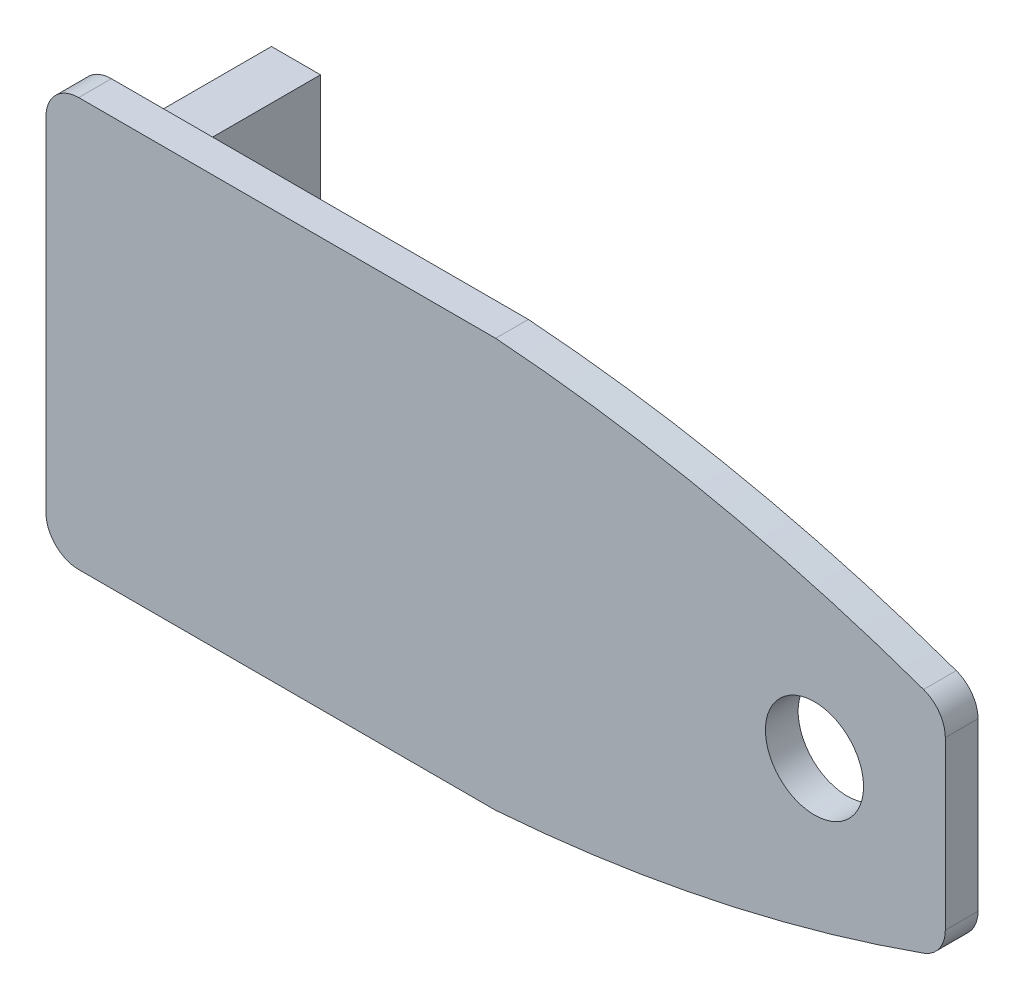
ISO-10303-21;
HEADER;
FILE_DESCRIPTION(('STEP AP214'),'2;1');
FILE_NAME('part.step','',(''),(''),'','','');
FILE_SCHEMA(('AUTOMOTIVE_DESIGN { 1 0 10303 214 1 1 1 1 }'));
ENDSEC;
DATA;
#1=APPLICATION_CONTEXT('core data for automotive mechanical design processes');
#2=APPLICATION_PROTOCOL_DEFINITION('international standard','automotive_design',2000,#1);
#3=PRODUCT_CONTEXT('',#1,'mechanical');
#4=PRODUCT('Part','Part','',(#3));
#5=PRODUCT_RELATED_PRODUCT_CATEGORY('part','',(#4));
#6=PRODUCT_DEFINITION_FORMATION('','',#4);
#7=PRODUCT_DEFINITION_CONTEXT('part definition',#1,'design');
#8=PRODUCT_DEFINITION('design','',#6,#7);
#9=PRODUCT_DEFINITION_SHAPE('','',#8);
#10=(LENGTH_UNIT() NAMED_UNIT(*) SI_UNIT(.MILLI.,.METRE.));
#11=(NAMED_UNIT(*) PLANE_ANGLE_UNIT() SI_UNIT($,.RADIAN.));
#12=(NAMED_UNIT(*) SI_UNIT($,.STERADIAN.) SOLID_ANGLE_UNIT());
#13=UNCERTAINTY_MEASURE_WITH_UNIT(LENGTH_MEASURE(1.E-05),#10,'distance_accuracy_value','');
#14=(GEOMETRIC_REPRESENTATION_CONTEXT(3) GLOBAL_UNCERTAINTY_ASSIGNED_CONTEXT((#13)) GLOBAL_UNIT_ASSIGNED_CONTEXT((#10,
#11,#12)) REPRESENTATION_CONTEXT('',''));
#15=CARTESIAN_POINT('',(0.,0.,0.));
#16=DIRECTION('',(0.,0.,1.));
#17=DIRECTION('',(1.,0.,0.));
#18=AXIS2_PLACEMENT_3D('',#15,#16,#17);
#19=CARTESIAN_POINT('',(34.925,-15.875,2.54));
#20=DIRECTION('',(-1.,0.,0.));
#21=DIRECTION('',(0.,0.,1.));
#22=AXIS2_PLACEMENT_3D('',#19,#20,#21);
#23=PLANE('',#22);
#24=DIRECTION('',(0.,1.,0.));
#25=VECTOR('',#24,1.);
#26=CARTESIAN_POINT('',(34.925,-15.875,0.));
#27=LINE('',#26,#25);
#28=CARTESIAN_POINT('',(34.925,-6.47631169509133,0.));
#29=VERTEX_POINT('',#28);
#30=CARTESIAN_POINT('',(34.925,6.47631169509136,0.));
#31=VERTEX_POINT('',#30);
#32=EDGE_CURVE('E210',#29,#31,#27,.T.);
#33=ORIENTED_EDGE('',*,*,#32,.T.);
#34=DIRECTION('',(0.,0.,1.));
#35=VECTOR('',#34,1.);
#36=CARTESIAN_POINT('',(34.925,6.47631169509136,2.54));
#37=LINE('',#36,#35);
#38=CARTESIAN_POINT('',(34.925,6.47631169509136,2.54));
#39=VERTEX_POINT('',#38);
#40=EDGE_CURVE('E244',#31,#39,#37,.T.);
#41=ORIENTED_EDGE('',*,*,#40,.T.);
#42=DIRECTION('',(0.,1.,0.));
#43=VECTOR('',#42,1.);
#44=CARTESIAN_POINT('',(34.925,-15.875,2.54));
#45=LINE('',#44,#43);
#46=CARTESIAN_POINT('',(34.925,-6.47631169509133,2.54));
#47=VERTEX_POINT('',#46);
#48=EDGE_CURVE('E189',#47,#39,#45,.T.);
#49=ORIENTED_EDGE('',*,*,#48,.F.);
#50=DIRECTION('',(0.,0.,1.));
#51=VECTOR('',#50,1.);
#52=CARTESIAN_POINT('',(34.925,-6.47631169509133,2.54));
#53=LINE('',#52,#51);
#54=EDGE_CURVE('E245',#47,#29,#53,.F.);
#55=ORIENTED_EDGE('',*,*,#54,.T.);
#56=EDGE_LOOP('',(#33,#41,#49,#55));
#57=FACE_BOUND('',#56,.T.);
#58=ADVANCED_FACE('F50',(#57),#23,.F.);
#59=CARTESIAN_POINT('',(34.925,15.875,2.54));
#60=DIRECTION('',(0.,-1.,0.));
#61=DIRECTION('',(0.,0.,-1.));
#62=AXIS2_PLACEMENT_3D('',#59,#60,#61);
#63=PLANE('',#62);
#64=DIRECTION('',(-1.,0.,0.));
#65=VECTOR('',#64,1.);
#66=CARTESIAN_POINT('',(34.925,15.875,0.));
#67=LINE('',#66,#65);
#68=CARTESIAN_POINT('',(0.,15.875,0.));
#69=VERTEX_POINT('',#68);
#70=CARTESIAN_POINT('',(-32.385,15.875,0.));
#71=VERTEX_POINT('',#70);
#72=EDGE_CURVE('E214',#69,#71,#67,.T.);
#73=ORIENTED_EDGE('',*,*,#72,.T.);
#74=DIRECTION('',(0.,0.,-1.));
#75=VECTOR('',#74,1.);
#76=CARTESIAN_POINT('',(-32.385,15.875,2.54));
#77=LINE('',#76,#75);
#78=CARTESIAN_POINT('',(-32.385,15.875,2.54));
#79=VERTEX_POINT('',#78);
#80=EDGE_CURVE('E184',#71,#79,#77,.F.);
#81=ORIENTED_EDGE('',*,*,#80,.T.);
#82=DIRECTION('',(-1.,0.,0.));
#83=VECTOR('',#82,1.);
#84=CARTESIAN_POINT('',(34.925,15.875,2.54));
#85=LINE('',#84,#83);
#86=CARTESIAN_POINT('',(0.,15.875,2.54));
#87=VERTEX_POINT('',#86);
#88=EDGE_CURVE('E180',#87,#79,#85,.T.);
#89=ORIENTED_EDGE('',*,*,#88,.F.);
#90=DIRECTION('',(0.,0.,1.));
#91=VECTOR('',#90,1.);
#92=CARTESIAN_POINT('',(0.,15.875,-7.62));
#93=LINE('',#92,#91);
#94=EDGE_CURVE('E163',#69,#87,#93,.T.);
#95=ORIENTED_EDGE('',*,*,#94,.F.);
#96=EDGE_LOOP('',(#73,#81,#89,#95));
#97=FACE_BOUND('',#96,.T.);
#98=ADVANCED_FACE('F182',(#97),#63,.F.);
#99=CARTESIAN_POINT('',(0.,0.,0.));
#100=DIRECTION('',(0.,0.,1.));
#101=DIRECTION('',(1.,0.,0.));
#102=AXIS2_PLACEMENT_3D('',#99,#100,#101);
#103=PLANE('',#102);
#104=CARTESIAN_POINT('',(24.765,0.,0.));
#105=DIRECTION('',(0.,0.,1.));
#106=DIRECTION('',(1.,0.,0.));
#107=AXIS2_PLACEMENT_3D('',#104,#105,#106);
#108=CIRCLE('',#107,3.81);
#109=CARTESIAN_POINT('',(28.575,0.,0.));
#110=VERTEX_POINT('',#109);
#111=EDGE_CURVE('E379',#110,#110,#108,.T.);
#112=ORIENTED_EDGE('',*,*,#111,.T.);
#113=EDGE_LOOP('',(#112));
#114=FACE_BOUND('',#113,.T.);
#115=DIRECTION('',(0.,-1.,0.));
#116=VECTOR('',#115,1.);
#117=CARTESIAN_POINT('',(-25.7952924012449,-14.605,0.));
#118=LINE('',#117,#116);
#119=CARTESIAN_POINT('',(-25.7952924012449,14.605,0.));
#120=VERTEX_POINT('',#119);
#121=CARTESIAN_POINT('',(-25.7952924012449,-14.605,0.));
#122=VERTEX_POINT('',#121);
#123=EDGE_CURVE('E347',#120,#122,#118,.T.);
#124=ORIENTED_EDGE('',*,*,#123,.F.);
#125=DIRECTION('',(1.,0.,0.));
#126=VECTOR('',#125,1.);
#127=CARTESIAN_POINT('',(-29.6052924012449,14.605,0.));
#128=LINE('',#127,#126);
#129=CARTESIAN_POINT('',(-29.6052924012449,14.605,0.));
#130=VERTEX_POINT('',#129);
#131=EDGE_CURVE('E334',#130,#120,#128,.T.);
#132=ORIENTED_EDGE('',*,*,#131,.F.);
#133=DIRECTION('',(0.,1.,0.));
#134=VECTOR('',#133,1.);
#135=CARTESIAN_POINT('',(-29.6052924012449,-14.605,0.));
#136=LINE('',#135,#134);
#137=CARTESIAN_POINT('',(-29.6052924012449,-14.605,0.));
#138=VERTEX_POINT('',#137);
#139=EDGE_CURVE('E338',#138,#130,#136,.T.);
#140=ORIENTED_EDGE('',*,*,#139,.F.);
#141=DIRECTION('',(-1.,0.,0.));
#142=VECTOR('',#141,1.);
#143=CARTESIAN_POINT('',(-29.6052924012449,-14.605,0.));
#144=LINE('',#143,#142);
#145=EDGE_CURVE('E343',#122,#138,#144,.T.);
#146=ORIENTED_EDGE('',*,*,#145,.F.);
#147=EDGE_LOOP('',(#124,#132,#140,#146));
#148=FACE_BOUND('',#147,.T.);
#149=CARTESIAN_POINT('',(-9.34027816487747,-110.781066589022,0.));
#150=DIRECTION('',(0.,0.,1.));
#151=DIRECTION('',(1.,0.,0.));
#152=AXIS2_PLACEMENT_3D('',#149,#150,#151);
#153=CIRCLE('',#152,127.);
#154=CARTESIAN_POINT('',(33.2365362890791,8.86931941517528,0.));
#155=VERTEX_POINT('',#154);
#156=EDGE_CURVE('E164',#69,#155,#153,.F.);
#157=ORIENTED_EDGE('',*,*,#156,.T.);
#158=CARTESIAN_POINT('',(32.385,6.47631169509136,0.));
#159=DIRECTION('',(0.,0.,1.));
#160=DIRECTION('',(1.,0.,0.));
#161=AXIS2_PLACEMENT_3D('',#158,#159,#160);
#162=CIRCLE('',#161,2.54);
#163=EDGE_CURVE('E57',#155,#31,#162,.F.);
#164=ORIENTED_EDGE('',*,*,#163,.T.);
#165=ORIENTED_EDGE('',*,*,#32,.F.);
#166=CARTESIAN_POINT('',(32.385,-6.47631169509133,0.));
#167=DIRECTION('',(0.,0.,1.));
#168=DIRECTION('',(1.,0.,0.));
#169=AXIS2_PLACEMENT_3D('',#166,#167,#168);
#170=CIRCLE('',#169,2.54);
#171=CARTESIAN_POINT('',(33.2365362890791,-8.86931941517526,0.));
#172=VERTEX_POINT('',#171);
#173=EDGE_CURVE('E65',#29,#172,#170,.F.);
#174=ORIENTED_EDGE('',*,*,#173,.T.);
#175=CARTESIAN_POINT('',(-9.3402781648775,110.781066589022,0.));
#176=DIRECTION('',(0.,0.,1.));
#177=DIRECTION('',(1.,0.,0.));
#178=AXIS2_PLACEMENT_3D('',#175,#176,#177);
#179=CIRCLE('',#178,127.);
#180=CARTESIAN_POINT('',(0.,-15.875,0.));
#181=VERTEX_POINT('',#180);
#182=EDGE_CURVE('E171',#172,#181,#179,.F.);
#183=ORIENTED_EDGE('',*,*,#182,.T.);
#184=DIRECTION('',(1.,0.,0.));
#185=VECTOR('',#184,1.);
#186=CARTESIAN_POINT('',(34.925,-15.875,0.));
#187=LINE('',#186,#185);
#188=CARTESIAN_POINT('',(-32.385,-15.875,0.));
#189=VERTEX_POINT('',#188);
#190=EDGE_CURVE('E205',#189,#181,#187,.T.);
#191=ORIENTED_EDGE('',*,*,#190,.F.);
#192=CARTESIAN_POINT('',(-32.385,-13.335,0.));
#193=DIRECTION('',(0.,0.,1.));
#194=DIRECTION('',(1.,0.,0.));
#195=AXIS2_PLACEMENT_3D('',#192,#193,#194);
#196=CIRCLE('',#195,2.54);
#197=CARTESIAN_POINT('',(-34.925,-13.335,0.));
#198=VERTEX_POINT('',#197);
#199=EDGE_CURVE('E222',#189,#198,#196,.F.);
#200=ORIENTED_EDGE('',*,*,#199,.T.);
#201=DIRECTION('',(0.,-1.,0.));
#202=VECTOR('',#201,1.);
#203=CARTESIAN_POINT('',(-34.925,-15.875,0.));
#204=LINE('',#203,#202);
#205=CARTESIAN_POINT('',(-34.925,13.335,0.));
#206=VERTEX_POINT('',#205);
#207=EDGE_CURVE('E197',#206,#198,#204,.T.);
#208=ORIENTED_EDGE('',*,*,#207,.F.);
#209=CARTESIAN_POINT('',(-32.385,13.335,0.));
#210=DIRECTION('',(0.,0.,1.));
#211=DIRECTION('',(1.,0.,0.));
#212=AXIS2_PLACEMENT_3D('',#209,#210,#211);
#213=CIRCLE('',#212,2.54);
#214=EDGE_CURVE('E223',#206,#71,#213,.F.);
#215=ORIENTED_EDGE('',*,*,#214,.T.);
#216=ORIENTED_EDGE('',*,*,#72,.F.);
#217=EDGE_LOOP('',(#157,#164,#165,#174,#183,#191,#200,#208,#215,#216));
#218=FACE_BOUND('',#217,.T.);
#219=ADVANCED_FACE('F258',(#114,#148,#218),#103,.F.);
#220=CARTESIAN_POINT('',(0.,0.,2.54));
#221=DIRECTION('',(0.,0.,1.));
#222=DIRECTION('',(1.,0.,0.));
#223=AXIS2_PLACEMENT_3D('',#220,#221,#222);
#224=PLANE('',#223);
#225=CARTESIAN_POINT('',(24.765,0.,2.54));
#226=DIRECTION('',(0.,0.,1.));
#227=DIRECTION('',(1.,0.,0.));
#228=AXIS2_PLACEMENT_3D('',#225,#226,#227);
#229=CIRCLE('',#228,3.81);
#230=CARTESIAN_POINT('',(28.575,0.,2.54));
#231=VERTEX_POINT('',#230);
#232=EDGE_CURVE('E383',#231,#231,#229,.T.);
#233=ORIENTED_EDGE('',*,*,#232,.F.);
#234=EDGE_LOOP('',(#233));
#235=FACE_BOUND('',#234,.T.);
#236=ORIENTED_EDGE('',*,*,#48,.T.);
#237=CARTESIAN_POINT('',(32.385,6.47631169509136,2.54));
#238=DIRECTION('',(0.,0.,1.));
#239=DIRECTION('',(1.,0.,0.));
#240=AXIS2_PLACEMENT_3D('',#237,#238,#239);
#241=CIRCLE('',#240,2.54);
#242=CARTESIAN_POINT('',(33.2365362890791,8.86931941517528,2.54));
#243=VERTEX_POINT('',#242);
#244=EDGE_CURVE('E177',#39,#243,#241,.T.);
#245=ORIENTED_EDGE('',*,*,#244,.T.);
#246=CARTESIAN_POINT('',(-9.34027816487747,-110.781066589022,2.54));
#247=DIRECTION('',(0.,0.,-1.));
#248=DIRECTION('',(-1.,0.,0.));
#249=AXIS2_PLACEMENT_3D('',#246,#247,#248);
#250=CIRCLE('',#249,127.);
#251=EDGE_CURVE('E165',#87,#243,#250,.T.);
#252=ORIENTED_EDGE('',*,*,#251,.F.);
#253=ORIENTED_EDGE('',*,*,#88,.T.);
#254=CARTESIAN_POINT('',(-32.385,13.335,2.54));
#255=DIRECTION('',(0.,0.,1.));
#256=DIRECTION('',(1.,0.,0.));
#257=AXIS2_PLACEMENT_3D('',#254,#255,#256);
#258=CIRCLE('',#257,2.54);
#259=CARTESIAN_POINT('',(-34.925,13.335,2.54));
#260=VERTEX_POINT('',#259);
#261=EDGE_CURVE('E234',#79,#260,#258,.T.);
#262=ORIENTED_EDGE('',*,*,#261,.T.);
#263=DIRECTION('',(0.,-1.,0.));
#264=VECTOR('',#263,1.);
#265=CARTESIAN_POINT('',(-34.925,-15.875,2.54));
#266=LINE('',#265,#264);
#267=CARTESIAN_POINT('',(-34.925,-13.335,2.54));
#268=VERTEX_POINT('',#267);
#269=EDGE_CURVE('E215',#260,#268,#266,.T.);
#270=ORIENTED_EDGE('',*,*,#269,.T.);
#271=CARTESIAN_POINT('',(-32.385,-13.335,2.54));
#272=DIRECTION('',(0.,0.,1.));
#273=DIRECTION('',(1.,0.,0.));
#274=AXIS2_PLACEMENT_3D('',#271,#272,#273);
#275=CIRCLE('',#274,2.54);
#276=CARTESIAN_POINT('',(-32.385,-15.875,2.54));
#277=VERTEX_POINT('',#276);
#278=EDGE_CURVE('E240',#268,#277,#275,.T.);
#279=ORIENTED_EDGE('',*,*,#278,.T.);
#280=DIRECTION('',(1.,0.,0.));
#281=VECTOR('',#280,1.);
#282=CARTESIAN_POINT('',(34.925,-15.875,2.54));
#283=LINE('',#282,#281);
#284=CARTESIAN_POINT('',(0.,-15.875,2.54));
#285=VERTEX_POINT('',#284);
#286=EDGE_CURVE('E193',#277,#285,#283,.T.);
#287=ORIENTED_EDGE('',*,*,#286,.T.);
#288=CARTESIAN_POINT('',(-9.3402781648775,110.781066589022,2.54));
#289=DIRECTION('',(0.,0.,-1.));
#290=DIRECTION('',(1.,0.,0.));
#291=AXIS2_PLACEMENT_3D('',#288,#289,#290);
#292=CIRCLE('',#291,127.);
#293=CARTESIAN_POINT('',(33.2365362890791,-8.86931941517526,2.54));
#294=VERTEX_POINT('',#293);
#295=EDGE_CURVE('E181',#294,#285,#292,.T.);
#296=ORIENTED_EDGE('',*,*,#295,.F.);
#297=CARTESIAN_POINT('',(32.385,-6.47631169509133,2.54));
#298=DIRECTION('',(0.,0.,1.));
#299=DIRECTION('',(1.,0.,0.));
#300=AXIS2_PLACEMENT_3D('',#297,#298,#299);
#301=CIRCLE('',#300,2.54);
#302=EDGE_CURVE('E248',#294,#47,#301,.T.);
#303=ORIENTED_EDGE('',*,*,#302,.T.);
#304=EDGE_LOOP('',(#236,#245,#252,#253,#262,#270,#279,#287,#296,#303));
#305=FACE_BOUND('',#304,.T.);
#306=ADVANCED_FACE('F176',(#235,#305),#224,.T.);
#307=CARTESIAN_POINT('',(-25.7952924012449,-14.605,-9.652));
#308=DIRECTION('',(-1.,0.,0.));
#309=DIRECTION('',(0.,0.,1.));
#310=AXIS2_PLACEMENT_3D('',#307,#308,#309);
#311=PLANE('',#310);
#312=CARTESIAN_POINT('',(-25.7952924012449,0.,-9.652));
#313=DIRECTION('',(1.,0.,0.));
#314=DIRECTION('',(0.,0.,-1.));
#315=AXIS2_PLACEMENT_3D('',#312,#313,#314);
#316=CIRCLE('',#315,5.08);
#317=CARTESIAN_POINT('',(-25.7952924012449,5.08,-9.652));
#318=VERTEX_POINT('',#317);
#319=CARTESIAN_POINT('',(-25.7952924012449,-5.08,-9.652));
#320=VERTEX_POINT('',#319);
#321=EDGE_CURVE('E369',#318,#320,#316,.T.);
#322=ORIENTED_EDGE('',*,*,#321,.F.);
#323=DIRECTION('',(0.,-1.,0.));
#324=VECTOR('',#323,1.);
#325=CARTESIAN_POINT('',(-25.7952924012449,-14.605,-9.652));
#326=LINE('',#325,#324);
#327=CARTESIAN_POINT('',(-25.7952924012449,14.605,-9.652));
#328=VERTEX_POINT('',#327);
#329=EDGE_CURVE('E361',#328,#318,#326,.T.);
#330=ORIENTED_EDGE('',*,*,#329,.F.);
#331=DIRECTION('',(0.,0.,1.));
#332=VECTOR('',#331,1.);
#333=CARTESIAN_POINT('',(-25.7952924012449,14.605,-9.652));
#334=LINE('',#333,#332);
#335=EDGE_CURVE('E329',#328,#120,#334,.T.);
#336=ORIENTED_EDGE('',*,*,#335,.T.);
#337=ORIENTED_EDGE('',*,*,#123,.T.);
#338=DIRECTION('',(0.,0.,1.));
#339=VECTOR('',#338,1.);
#340=CARTESIAN_POINT('',(-25.7952924012449,-14.605,-9.652));
#341=LINE('',#340,#339);
#342=CARTESIAN_POINT('',(-25.7952924012449,-14.605,-9.652));
#343=VERTEX_POINT('',#342);
#344=EDGE_CURVE('E201',#343,#122,#341,.T.);
#345=ORIENTED_EDGE('',*,*,#344,.F.);
#346=EDGE_CURVE('E339',#320,#343,#326,.T.);
#347=ORIENTED_EDGE('',*,*,#346,.F.);
#348=EDGE_LOOP('',(#322,#330,#336,#337,#345,#347));
#349=FACE_BOUND('',#348,.T.);
#350=ADVANCED_FACE('F392',(#349),#311,.F.);
#351=CARTESIAN_POINT('',(0.,0.,-9.652));
#352=DIRECTION('',(0.,0.,-1.));
#353=DIRECTION('',(-1.,0.,0.));
#354=AXIS2_PLACEMENT_3D('',#351,#352,#353);
#355=PLANE('',#354);
#356=DIRECTION('',(1.,0.,0.));
#357=VECTOR('',#356,1.);
#358=CARTESIAN_POINT('',(-35.9552924012448,5.08,-9.652));
#359=LINE('',#358,#357);
#360=CARTESIAN_POINT('',(-29.6052924012449,5.08,-9.652));
#361=VERTEX_POINT('',#360);
#362=EDGE_CURVE('E191',#361,#318,#359,.T.);
#363=ORIENTED_EDGE('',*,*,#362,.F.);
#364=DIRECTION('',(0.,1.,0.));
#365=VECTOR('',#364,1.);
#366=CARTESIAN_POINT('',(-29.6052924012449,-14.605,-9.652));
#367=LINE('',#366,#365);
#368=CARTESIAN_POINT('',(-29.6052924012449,14.605,-9.652));
#369=VERTEX_POINT('',#368);
#370=EDGE_CURVE('E360',#361,#369,#367,.T.);
#371=ORIENTED_EDGE('',*,*,#370,.T.);
#372=DIRECTION('',(1.,0.,0.));
#373=VECTOR('',#372,1.);
#374=CARTESIAN_POINT('',(-29.6052924012449,14.605,-9.652));
#375=LINE('',#374,#373);
#376=EDGE_CURVE('E332',#369,#328,#375,.T.);
#377=ORIENTED_EDGE('',*,*,#376,.T.);
#378=ORIENTED_EDGE('',*,*,#329,.T.);
#379=EDGE_LOOP('',(#363,#371,#377,#378));
#380=FACE_BOUND('',#379,.T.);
#381=ADVANCED_FACE('F294',(#380),#355,.T.);
#382=CARTESIAN_POINT('',(-34.925,-15.875,2.54));
#383=DIRECTION('',(1.,0.,0.));
#384=DIRECTION('',(0.,0.,-1.));
#385=AXIS2_PLACEMENT_3D('',#382,#383,#384);
#386=PLANE('',#385);
#387=ORIENTED_EDGE('',*,*,#207,.T.);
#388=DIRECTION('',(0.,0.,-1.));
#389=VECTOR('',#388,1.);
#390=CARTESIAN_POINT('',(-34.925,-13.335,2.54));
#391=LINE('',#390,#389);
#392=EDGE_CURVE('E233',#198,#268,#391,.F.);
#393=ORIENTED_EDGE('',*,*,#392,.T.);
#394=ORIENTED_EDGE('',*,*,#269,.F.);
#395=DIRECTION('',(0.,0.,-1.));
#396=VECTOR('',#395,1.);
#397=CARTESIAN_POINT('',(-34.925,13.335,2.54));
#398=LINE('',#397,#396);
#399=EDGE_CURVE('E227',#260,#206,#398,.T.);
#400=ORIENTED_EDGE('',*,*,#399,.T.);
#401=EDGE_LOOP('',(#387,#393,#394,#400));
#402=FACE_BOUND('',#401,.T.);
#403=ADVANCED_FACE('F293',(#402),#386,.F.);
#404=CARTESIAN_POINT('',(34.925,-15.875,2.54));
#405=DIRECTION('',(0.,1.,0.));
#406=DIRECTION('',(-1.,0.,0.));
#407=AXIS2_PLACEMENT_3D('',#404,#405,#406);
#408=PLANE('',#407);
#409=ORIENTED_EDGE('',*,*,#286,.F.);
#410=DIRECTION('',(0.,0.,-1.));
#411=VECTOR('',#410,1.);
#412=CARTESIAN_POINT('',(-32.385,-15.875,2.54));
#413=LINE('',#412,#411);
#414=EDGE_CURVE('E220',#277,#189,#413,.T.);
#415=ORIENTED_EDGE('',*,*,#414,.T.);
#416=ORIENTED_EDGE('',*,*,#190,.T.);
#417=DIRECTION('',(0.,0.,1.));
#418=VECTOR('',#417,1.);
#419=CARTESIAN_POINT('',(0.,-15.875,-7.62));
#420=LINE('',#419,#418);
#421=EDGE_CURVE('E313',#181,#285,#420,.T.);
#422=ORIENTED_EDGE('',*,*,#421,.T.);
#423=EDGE_LOOP('',(#409,#415,#416,#422));
#424=FACE_BOUND('',#423,.T.);
#425=ADVANCED_FACE('F290',(#424),#408,.F.);
#426=CARTESIAN_POINT('',(-29.6052924012449,-14.605,-9.652));
#427=DIRECTION('',(0.,1.,0.));
#428=DIRECTION('',(0.,0.,1.));
#429=AXIS2_PLACEMENT_3D('',#426,#427,#428);
#430=PLANE('',#429);
#431=ORIENTED_EDGE('',*,*,#145,.T.);
#432=DIRECTION('',(0.,0.,1.));
#433=VECTOR('',#432,1.);
#434=CARTESIAN_POINT('',(-29.6052924012449,-14.605,-9.652));
#435=LINE('',#434,#433);
#436=CARTESIAN_POINT('',(-29.6052924012449,-14.605,-9.652));
#437=VERTEX_POINT('',#436);
#438=EDGE_CURVE('E321',#437,#138,#435,.T.);
#439=ORIENTED_EDGE('',*,*,#438,.F.);
#440=DIRECTION('',(-1.,0.,0.));
#441=VECTOR('',#440,1.);
#442=CARTESIAN_POINT('',(-29.6052924012449,-14.605,-9.652));
#443=LINE('',#442,#441);
#444=EDGE_CURVE('E359',#343,#437,#443,.T.);
#445=ORIENTED_EDGE('',*,*,#444,.F.);
#446=ORIENTED_EDGE('',*,*,#344,.T.);
#447=EDGE_LOOP('',(#431,#439,#445,#446));
#448=FACE_BOUND('',#447,.T.);
#449=ADVANCED_FACE('F289',(#448),#430,.F.);
#450=CARTESIAN_POINT('',(-29.6052924012449,-14.605,-9.652));
#451=DIRECTION('',(1.,0.,0.));
#452=DIRECTION('',(0.,0.,-1.));
#453=AXIS2_PLACEMENT_3D('',#450,#451,#452);
#454=PLANE('',#453);
#455=ORIENTED_EDGE('',*,*,#370,.F.);
#456=CARTESIAN_POINT('',(-29.6052924012449,0.,-9.652));
#457=DIRECTION('',(1.,0.,0.));
#458=DIRECTION('',(0.,0.,-1.));
#459=AXIS2_PLACEMENT_3D('',#456,#457,#458);
#460=CIRCLE('',#459,5.08);
#461=CARTESIAN_POINT('',(-29.6052924012449,-5.08,-9.652));
#462=VERTEX_POINT('',#461);
#463=EDGE_CURVE('E355',#361,#462,#460,.T.);
#464=ORIENTED_EDGE('',*,*,#463,.T.);
#465=EDGE_CURVE('E354',#437,#462,#367,.T.);
#466=ORIENTED_EDGE('',*,*,#465,.F.);
#467=ORIENTED_EDGE('',*,*,#438,.T.);
#468=ORIENTED_EDGE('',*,*,#139,.T.);
#469=DIRECTION('',(0.,0.,1.));
#470=VECTOR('',#469,1.);
#471=CARTESIAN_POINT('',(-29.6052924012449,14.605,-9.652));
#472=LINE('',#471,#470);
#473=EDGE_CURVE('E326',#369,#130,#472,.T.);
#474=ORIENTED_EDGE('',*,*,#473,.F.);
#475=EDGE_LOOP('',(#455,#464,#466,#467,#468,#474));
#476=FACE_BOUND('',#475,.T.);
#477=ADVANCED_FACE('F409',(#476),#454,.F.);
#478=CARTESIAN_POINT('',(-29.6052924012449,14.605,-9.652));
#479=DIRECTION('',(0.,-1.,0.));
#480=DIRECTION('',(0.,0.,-1.));
#481=AXIS2_PLACEMENT_3D('',#478,#479,#480);
#482=PLANE('',#481);
#483=ORIENTED_EDGE('',*,*,#131,.T.);
#484=ORIENTED_EDGE('',*,*,#335,.F.);
#485=ORIENTED_EDGE('',*,*,#376,.F.);
#486=ORIENTED_EDGE('',*,*,#473,.T.);
#487=EDGE_LOOP('',(#483,#484,#485,#486));
#488=FACE_BOUND('',#487,.T.);
#489=ADVANCED_FACE('F407',(#488),#482,.F.);
#490=DIRECTION('',(1.,0.,0.));
#491=VECTOR('',#490,1.);
#492=CARTESIAN_POINT('',(-35.9552924012448,-5.08,-9.652));
#493=LINE('',#492,#491);
#494=EDGE_CURVE('E190',#320,#462,#493,.F.);
#495=ORIENTED_EDGE('',*,*,#494,.F.);
#496=ORIENTED_EDGE('',*,*,#346,.T.);
#497=ORIENTED_EDGE('',*,*,#444,.T.);
#498=ORIENTED_EDGE('',*,*,#465,.T.);
#499=EDGE_LOOP('',(#495,#496,#497,#498));
#500=FACE_BOUND('',#499,.T.);
#501=ADVANCED_FACE('F413',(#500),#355,.T.);
#502=CARTESIAN_POINT('',(-35.9552924012448,0.,-9.652));
#503=DIRECTION('',(1.,0.,0.));
#504=DIRECTION('',(0.,0.,-1.));
#505=AXIS2_PLACEMENT_3D('',#502,#503,#504);
#506=CYLINDRICAL_SURFACE('',#505,5.08);
#507=ORIENTED_EDGE('',*,*,#362,.T.);
#508=ORIENTED_EDGE('',*,*,#321,.T.);
#509=ORIENTED_EDGE('',*,*,#494,.T.);
#510=ORIENTED_EDGE('',*,*,#463,.F.);
#511=EDGE_LOOP('',(#507,#508,#509,#510));
#512=FACE_BOUND('',#511,.T.);
#513=ADVANCED_FACE('F416',(#512),#506,.F.);
#514=CARTESIAN_POINT('',(-9.3402781648775,110.781066589022,-7.62));
#515=DIRECTION('',(0.,0.,1.));
#516=DIRECTION('',(1.,0.,0.));
#517=AXIS2_PLACEMENT_3D('',#514,#515,#516);
#518=CYLINDRICAL_SURFACE('',#517,127.);
#519=ORIENTED_EDGE('',*,*,#182,.F.);
#520=DIRECTION('',(0.,0.,1.));
#521=VECTOR('',#520,1.);
#522=CARTESIAN_POINT('',(33.2365362890791,-8.86931941517528,-7.62));
#523=LINE('',#522,#521);
#524=EDGE_CURVE('E11',#172,#294,#523,.T.);
#525=ORIENTED_EDGE('',*,*,#524,.T.);
#526=ORIENTED_EDGE('',*,*,#295,.T.);
#527=ORIENTED_EDGE('',*,*,#421,.F.);
#528=EDGE_LOOP('',(#519,#525,#526,#527));
#529=FACE_BOUND('',#528,.T.);
#530=ADVANCED_FACE('F301',(#529),#518,.T.);
#531=CARTESIAN_POINT('',(-9.34027816487747,-110.781066589022,-7.62));
#532=DIRECTION('',(0.,0.,1.));
#533=DIRECTION('',(1.,0.,0.));
#534=AXIS2_PLACEMENT_3D('',#531,#532,#533);
#535=CYLINDRICAL_SURFACE('',#534,127.);
#536=ORIENTED_EDGE('',*,*,#251,.T.);
#537=DIRECTION('',(0.,0.,1.));
#538=VECTOR('',#537,1.);
#539=CARTESIAN_POINT('',(33.2365362890791,8.86931941517531,-7.62));
#540=LINE('',#539,#538);
#541=EDGE_CURVE('E73',#243,#155,#540,.F.);
#542=ORIENTED_EDGE('',*,*,#541,.T.);
#543=ORIENTED_EDGE('',*,*,#156,.F.);
#544=ORIENTED_EDGE('',*,*,#94,.T.);
#545=EDGE_LOOP('',(#536,#542,#543,#544));
#546=FACE_BOUND('',#545,.T.);
#547=ADVANCED_FACE('F161',(#546),#535,.T.);
#548=CARTESIAN_POINT('',(-32.385,-13.335,2.54));
#549=DIRECTION('',(0.,0.,-1.));
#550=DIRECTION('',(-1.,0.,0.));
#551=AXIS2_PLACEMENT_3D('',#548,#549,#550);
#552=CYLINDRICAL_SURFACE('',#551,2.54);
#553=ORIENTED_EDGE('',*,*,#278,.F.);
#554=ORIENTED_EDGE('',*,*,#392,.F.);
#555=ORIENTED_EDGE('',*,*,#199,.F.);
#556=ORIENTED_EDGE('',*,*,#414,.F.);
#557=EDGE_LOOP('',(#553,#554,#555,#556));
#558=FACE_BOUND('',#557,.T.);
#559=ADVANCED_FACE('F273',(#558),#552,.T.);
#560=CARTESIAN_POINT('',(-32.385,13.335,2.54));
#561=DIRECTION('',(0.,0.,-1.));
#562=DIRECTION('',(-1.,0.,0.));
#563=AXIS2_PLACEMENT_3D('',#560,#561,#562);
#564=CYLINDRICAL_SURFACE('',#563,2.54);
#565=ORIENTED_EDGE('',*,*,#261,.F.);
#566=ORIENTED_EDGE('',*,*,#80,.F.);
#567=ORIENTED_EDGE('',*,*,#214,.F.);
#568=ORIENTED_EDGE('',*,*,#399,.F.);
#569=EDGE_LOOP('',(#565,#566,#567,#568));
#570=FACE_BOUND('',#569,.T.);
#571=ADVANCED_FACE('F270',(#570),#564,.T.);
#572=CARTESIAN_POINT('',(32.385,6.47631169509136,-7.62));
#573=DIRECTION('',(0.,0.,1.));
#574=DIRECTION('',(1.,0.,0.));
#575=AXIS2_PLACEMENT_3D('',#572,#573,#574);
#576=CYLINDRICAL_SURFACE('',#575,2.54);
#577=ORIENTED_EDGE('',*,*,#163,.F.);
#578=ORIENTED_EDGE('',*,*,#541,.F.);
#579=ORIENTED_EDGE('',*,*,#244,.F.);
#580=ORIENTED_EDGE('',*,*,#40,.F.);
#581=EDGE_LOOP('',(#577,#578,#579,#580));
#582=FACE_BOUND('',#581,.T.);
#583=ADVANCED_FACE('F264',(#582),#576,.T.);
#584=CARTESIAN_POINT('',(32.385,-6.47631169509133,-7.62));
#585=DIRECTION('',(0.,0.,1.));
#586=DIRECTION('',(1.,0.,0.));
#587=AXIS2_PLACEMENT_3D('',#584,#585,#586);
#588=CYLINDRICAL_SURFACE('',#587,2.54);
#589=ORIENTED_EDGE('',*,*,#173,.F.);
#590=ORIENTED_EDGE('',*,*,#54,.F.);
#591=ORIENTED_EDGE('',*,*,#302,.F.);
#592=ORIENTED_EDGE('',*,*,#524,.F.);
#593=EDGE_LOOP('',(#589,#590,#591,#592));
#594=FACE_BOUND('',#593,.T.);
#595=ADVANCED_FACE('F47',(#594),#588,.T.);
#596=CARTESIAN_POINT('',(24.765,0.,-7.62));
#597=DIRECTION('',(0.,0.,1.));
#598=DIRECTION('',(1.,0.,0.));
#599=AXIS2_PLACEMENT_3D('',#596,#597,#598);
#600=CYLINDRICAL_SURFACE('',#599,3.81);
#601=ORIENTED_EDGE('',*,*,#232,.T.);
#602=EDGE_LOOP('',(#601));
#603=FACE_BOUND('',#602,.T.);
#604=ORIENTED_EDGE('',*,*,#111,.F.);
#605=EDGE_LOOP('',(#604));
#606=FACE_BOUND('',#605,.T.);
#607=ADVANCED_FACE('F275',(#603,#606),#600,.F.);
#608=CLOSED_SHELL('',(#58,#98,#219,#306,#350,#381,#403,#425,#449,#477,#489,#501,#513,#530,#547,
#559,#571,#583,#595,#607));
#609=MANIFOLD_SOLID_BREP('B2',#608);
#610=ADVANCED_BREP_SHAPE_REPRESENTATION('',(#18,#609),#14);
#611=SHAPE_DEFINITION_REPRESENTATION(#9,#610);
ENDSEC;
END-ISO-10303-21;
